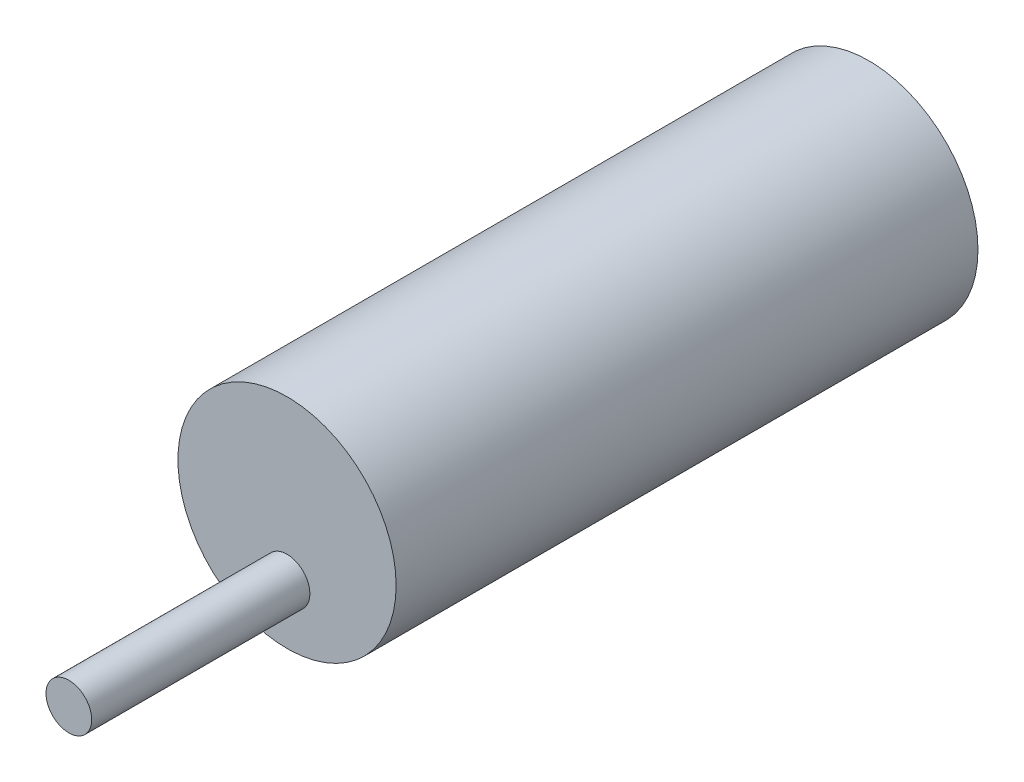
ISO-10303-21;
HEADER;
FILE_DESCRIPTION(('STEP AP214'),'2;1');
FILE_NAME('part.step','',(''),(''),'','','');
FILE_SCHEMA(('AUTOMOTIVE_DESIGN { 1 0 10303 214 1 1 1 1 }'));
ENDSEC;
DATA;
#1=APPLICATION_CONTEXT('core data for automotive mechanical design processes');
#2=APPLICATION_PROTOCOL_DEFINITION('international standard','automotive_design',2000,#1);
#3=PRODUCT_CONTEXT('',#1,'mechanical');
#4=PRODUCT('Part','Part','',(#3));
#5=PRODUCT_RELATED_PRODUCT_CATEGORY('part','',(#4));
#6=PRODUCT_DEFINITION_FORMATION('','',#4);
#7=PRODUCT_DEFINITION_CONTEXT('part definition',#1,'design');
#8=PRODUCT_DEFINITION('design','',#6,#7);
#9=PRODUCT_DEFINITION_SHAPE('','',#8);
#10=(LENGTH_UNIT() NAMED_UNIT(*) SI_UNIT(.MILLI.,.METRE.));
#11=(NAMED_UNIT(*) PLANE_ANGLE_UNIT() SI_UNIT($,.RADIAN.));
#12=(NAMED_UNIT(*) SI_UNIT($,.STERADIAN.) SOLID_ANGLE_UNIT());
#13=UNCERTAINTY_MEASURE_WITH_UNIT(LENGTH_MEASURE(1.E-05),#10,'distance_accuracy_value','');
#14=(GEOMETRIC_REPRESENTATION_CONTEXT(3) GLOBAL_UNCERTAINTY_ASSIGNED_CONTEXT((#13)) GLOBAL_UNIT_ASSIGNED_CONTEXT((#10,
#11,#12)) REPRESENTATION_CONTEXT('',''));
#15=CARTESIAN_POINT('',(0.,0.,0.));
#16=DIRECTION('',(0.,0.,1.));
#17=DIRECTION('',(1.,0.,0.));
#18=AXIS2_PLACEMENT_3D('',#15,#16,#17);
#19=CARTESIAN_POINT('',(0.,0.,101.6));
#20=DIRECTION('',(0.,0.,-1.));
#21=DIRECTION('',(-1.,0.,0.));
#22=AXIS2_PLACEMENT_3D('',#19,#20,#21);
#23=CYLINDRICAL_SURFACE('',#22,19.05);
#24=CARTESIAN_POINT('',(0.,0.,101.6));
#25=DIRECTION('',(0.,0.,1.));
#26=DIRECTION('',(1.,0.,0.));
#27=AXIS2_PLACEMENT_3D('',#24,#25,#26);
#28=CIRCLE('',#27,19.05);
#29=CARTESIAN_POINT('',(19.05,0.,101.6));
#30=VERTEX_POINT('',#29);
#31=EDGE_CURVE('E10',#30,#30,#28,.T.);
#32=ORIENTED_EDGE('',*,*,#31,.F.);
#33=EDGE_LOOP('',(#32));
#34=FACE_BOUND('',#33,.T.);
#35=CARTESIAN_POINT('',(0.,0.,0.));
#36=DIRECTION('',(0.,0.,1.));
#37=DIRECTION('',(1.,0.,0.));
#38=AXIS2_PLACEMENT_3D('',#35,#36,#37);
#39=CIRCLE('',#38,19.05);
#40=CARTESIAN_POINT('',(19.05,0.,0.));
#41=VERTEX_POINT('',#40);
#42=EDGE_CURVE('E33',#41,#41,#39,.T.);
#43=ORIENTED_EDGE('',*,*,#42,.T.);
#44=EDGE_LOOP('',(#43));
#45=FACE_BOUND('',#44,.T.);
#46=ADVANCED_FACE('F30',(#34,#45),#23,.T.);
#47=CARTESIAN_POINT('',(0.,0.,101.6));
#48=DIRECTION('',(0.,0.,1.));
#49=DIRECTION('',(1.,0.,0.));
#50=AXIS2_PLACEMENT_3D('',#47,#48,#49);
#51=PLANE('',#50);
#52=CARTESIAN_POINT('',(0.,-8.76792713069207,101.6));
#53=DIRECTION('',(0.,0.,1.));
#54=DIRECTION('',(1.,0.,0.));
#55=AXIS2_PLACEMENT_3D('',#52,#53,#54);
#56=CIRCLE('',#55,3.9878);
#57=CARTESIAN_POINT('',(-3.9878,-8.76792713069207,101.6));
#58=VERTEX_POINT('',#57);
#59=EDGE_CURVE('E42',#58,#58,#56,.T.);
#60=ORIENTED_EDGE('',*,*,#59,.F.);
#61=EDGE_LOOP('',(#60));
#62=FACE_BOUND('',#61,.T.);
#63=ORIENTED_EDGE('',*,*,#31,.T.);
#64=EDGE_LOOP('',(#63));
#65=FACE_BOUND('',#64,.T.);
#66=ADVANCED_FACE('F57',(#62,#65),#51,.T.);
#67=CARTESIAN_POINT('',(0.,0.,0.));
#68=DIRECTION('',(0.,0.,1.));
#69=DIRECTION('',(1.,0.,0.));
#70=AXIS2_PLACEMENT_3D('',#67,#68,#69);
#71=PLANE('',#70);
#72=ORIENTED_EDGE('',*,*,#42,.F.);
#73=EDGE_LOOP('',(#72));
#74=FACE_BOUND('',#73,.T.);
#75=ADVANCED_FACE('F53',(#74),#71,.F.);
#76=CARTESIAN_POINT('',(0.,-8.76792713069207,139.7));
#77=DIRECTION('',(0.,0.,-1.));
#78=DIRECTION('',(-1.,0.,0.));
#79=AXIS2_PLACEMENT_3D('',#76,#77,#78);
#80=CYLINDRICAL_SURFACE('',#79,3.9878);
#81=CARTESIAN_POINT('',(0.,-8.76792713069207,139.7));
#82=DIRECTION('',(0.,0.,1.));
#83=DIRECTION('',(1.,0.,0.));
#84=AXIS2_PLACEMENT_3D('',#81,#82,#83);
#85=CIRCLE('',#84,3.9878);
#86=CARTESIAN_POINT('',(-3.9878,-8.76792713069207,139.7));
#87=VERTEX_POINT('',#86);
#88=EDGE_CURVE('E40',#87,#87,#85,.T.);
#89=CARTESIAN_POINT('',(-3.9878,-8.76792713069207,139.7));
#90=CARTESIAN_POINT('',(-3.9878,-8.76792713069207,139.303125));
#91=CARTESIAN_POINT('',(-3.9878,-8.76792713069207,138.90625));
#92=CARTESIAN_POINT('',(-3.9878,-8.76792713069207,138.1125));
#93=CARTESIAN_POINT('',(-3.9878,-8.76792713069207,137.715625));
#94=CARTESIAN_POINT('',(-3.9878,-8.76792713069207,136.921875));
#95=CARTESIAN_POINT('',(-3.9878,-8.76792713069207,136.525));
#96=CARTESIAN_POINT('',(-3.9878,-8.76792713069207,135.73125));
#97=CARTESIAN_POINT('',(-3.9878,-8.76792713069207,135.334375));
#98=CARTESIAN_POINT('',(-3.9878,-8.76792713069207,134.540625));
#99=CARTESIAN_POINT('',(-3.9878,-8.76792713069207,134.14375));
#100=CARTESIAN_POINT('',(-3.9878,-8.76792713069207,133.35));
#101=CARTESIAN_POINT('',(-3.9878,-8.76792713069207,132.953125));
#102=CARTESIAN_POINT('',(-3.9878,-8.76792713069207,132.159375));
#103=CARTESIAN_POINT('',(-3.9878,-8.76792713069207,131.7625));
#104=CARTESIAN_POINT('',(-3.9878,-8.76792713069207,130.96875));
#105=CARTESIAN_POINT('',(-3.9878,-8.76792713069207,130.571875));
#106=CARTESIAN_POINT('',(-3.9878,-8.76792713069207,129.778125));
#107=CARTESIAN_POINT('',(-3.9878,-8.76792713069207,129.38125));
#108=CARTESIAN_POINT('',(-3.9878,-8.76792713069207,128.5875));
#109=CARTESIAN_POINT('',(-3.9878,-8.76792713069207,128.190625));
#110=CARTESIAN_POINT('',(-3.9878,-8.76792713069207,127.396875));
#111=CARTESIAN_POINT('',(-3.9878,-8.76792713069207,127.));
#112=CARTESIAN_POINT('',(-3.9878,-8.76792713069207,126.20625));
#113=CARTESIAN_POINT('',(-3.9878,-8.76792713069207,125.809375));
#114=CARTESIAN_POINT('',(-3.9878,-8.76792713069207,125.015625));
#115=CARTESIAN_POINT('',(-3.9878,-8.76792713069207,124.61875));
#116=CARTESIAN_POINT('',(-3.9878,-8.76792713069207,123.825));
#117=CARTESIAN_POINT('',(-3.9878,-8.76792713069207,123.428125));
#118=CARTESIAN_POINT('',(-3.9878,-8.76792713069207,122.634375));
#119=CARTESIAN_POINT('',(-3.9878,-8.76792713069207,122.2375));
#120=CARTESIAN_POINT('',(-3.9878,-8.76792713069207,121.44375));
#121=CARTESIAN_POINT('',(-3.9878,-8.76792713069207,121.046875));
#122=CARTESIAN_POINT('',(-3.9878,-8.76792713069207,120.253125));
#123=CARTESIAN_POINT('',(-3.9878,-8.76792713069207,119.85625));
#124=CARTESIAN_POINT('',(-3.9878,-8.76792713069207,119.0625));
#125=CARTESIAN_POINT('',(-3.9878,-8.76792713069207,118.665625));
#126=CARTESIAN_POINT('',(-3.9878,-8.76792713069207,117.871875));
#127=CARTESIAN_POINT('',(-3.9878,-8.76792713069207,117.475));
#128=CARTESIAN_POINT('',(-3.9878,-8.76792713069207,116.68125));
#129=CARTESIAN_POINT('',(-3.9878,-8.76792713069207,116.284375));
#130=CARTESIAN_POINT('',(-3.9878,-8.76792713069207,115.490625));
#131=CARTESIAN_POINT('',(-3.9878,-8.76792713069207,115.09375));
#132=CARTESIAN_POINT('',(-3.9878,-8.76792713069207,114.3));
#133=CARTESIAN_POINT('',(-3.9878,-8.76792713069207,113.903125));
#134=CARTESIAN_POINT('',(-3.9878,-8.76792713069207,113.109375));
#135=CARTESIAN_POINT('',(-3.9878,-8.76792713069207,112.7125));
#136=CARTESIAN_POINT('',(-3.9878,-8.76792713069207,111.91875));
#137=CARTESIAN_POINT('',(-3.9878,-8.76792713069207,111.521875));
#138=CARTESIAN_POINT('',(-3.9878,-8.76792713069207,110.728125));
#139=CARTESIAN_POINT('',(-3.9878,-8.76792713069207,110.33125));
#140=CARTESIAN_POINT('',(-3.9878,-8.76792713069207,109.5375));
#141=CARTESIAN_POINT('',(-3.9878,-8.76792713069207,109.140625));
#142=CARTESIAN_POINT('',(-3.9878,-8.76792713069207,108.346875));
#143=CARTESIAN_POINT('',(-3.9878,-8.76792713069207,107.95));
#144=CARTESIAN_POINT('',(-3.9878,-8.76792713069207,107.15625));
#145=CARTESIAN_POINT('',(-3.9878,-8.76792713069207,106.759375));
#146=CARTESIAN_POINT('',(-3.9878,-8.76792713069207,105.965625));
#147=CARTESIAN_POINT('',(-3.9878,-8.76792713069207,105.56875));
#148=CARTESIAN_POINT('',(-3.9878,-8.76792713069207,104.775));
#149=CARTESIAN_POINT('',(-3.9878,-8.76792713069207,104.378125));
#150=CARTESIAN_POINT('',(-3.9878,-8.76792713069207,103.584375));
#151=CARTESIAN_POINT('',(-3.9878,-8.76792713069207,103.1875));
#152=CARTESIAN_POINT('',(-3.9878,-8.76792713069207,102.39375));
#153=CARTESIAN_POINT('',(-3.9878,-8.76792713069207,101.996875));
#154=CARTESIAN_POINT('',(-3.9878,-8.76792713069207,101.6));
#155=B_SPLINE_CURVE_WITH_KNOTS('',3,(#89,#90,#91,#92,#93,#94,#95,#96,#97,#98,#99,#100,#101,#102,
#103,#104,#105,#106,#107,#108,#109,#110,#111,#112,#113,#114,#115,#116,#117,#118,#119,#120,#121,
#122,#123,#124,#125,#126,#127,#128,#129,#130,#131,#132,#133,#134,#135,#136,#137,#138,#139,#140,
#141,#142,#143,#144,#145,#146,#147,#148,#149,#150,#151,#152,#153,#154),.UNSPECIFIED.,.F.,.F.,(4,
2,2,2,2,2,2,2,2,2,2,2,2,2,2,2,2,2,2,2,2,2,2,2,2,2,2,2,2,2,2,2,4),(0.,1.190625,2.38125,3.571875,
4.7625,5.953125,7.14375,8.334375,9.52500000000001,10.715625,11.90625,13.096875,14.2875,
15.478125,16.66875,17.859375,19.05,20.240625,21.43125,22.621875,23.8125,25.003125,26.19375,
27.384375,28.575,29.765625,30.95625,32.146875,33.3375,34.528125,35.71875,36.909375,38.1),.UNSPECIFIED.);
#156=EDGE_CURVE('BSEAM50',#87,#58,#155,.T.);
#157=ORIENTED_EDGE('',*,*,#88,.F.);
#158=ORIENTED_EDGE('',*,*,#59,.T.);
#159=ORIENTED_EDGE('',*,*,#156,.T.);
#160=ORIENTED_EDGE('',*,*,#156,.F.);
#161=EDGE_LOOP('',(#157,#159,#158,#160));
#162=FACE_BOUND('',#161,.T.);
#163=ADVANCED_FACE('F50',(#162),#80,.T.);
#164=CARTESIAN_POINT('',(0.,-8.76792713069207,139.7));
#165=DIRECTION('',(0.,0.,1.));
#166=DIRECTION('',(1.,0.,0.));
#167=AXIS2_PLACEMENT_3D('',#164,#165,#166);
#168=PLANE('',#167);
#169=ORIENTED_EDGE('',*,*,#88,.T.);
#170=EDGE_LOOP('',(#169));
#171=FACE_BOUND('',#170,.T.);
#172=ADVANCED_FACE('F48',(#171),#168,.T.);
#173=CLOSED_SHELL('',(#46,#66,#75,#163,#172));
#174=MANIFOLD_SOLID_BREP('B2',#173);
#175=ADVANCED_BREP_SHAPE_REPRESENTATION('',(#18,#174),#14);
#176=SHAPE_DEFINITION_REPRESENTATION(#9,#175);
ENDSEC;
END-ISO-10303-21;
